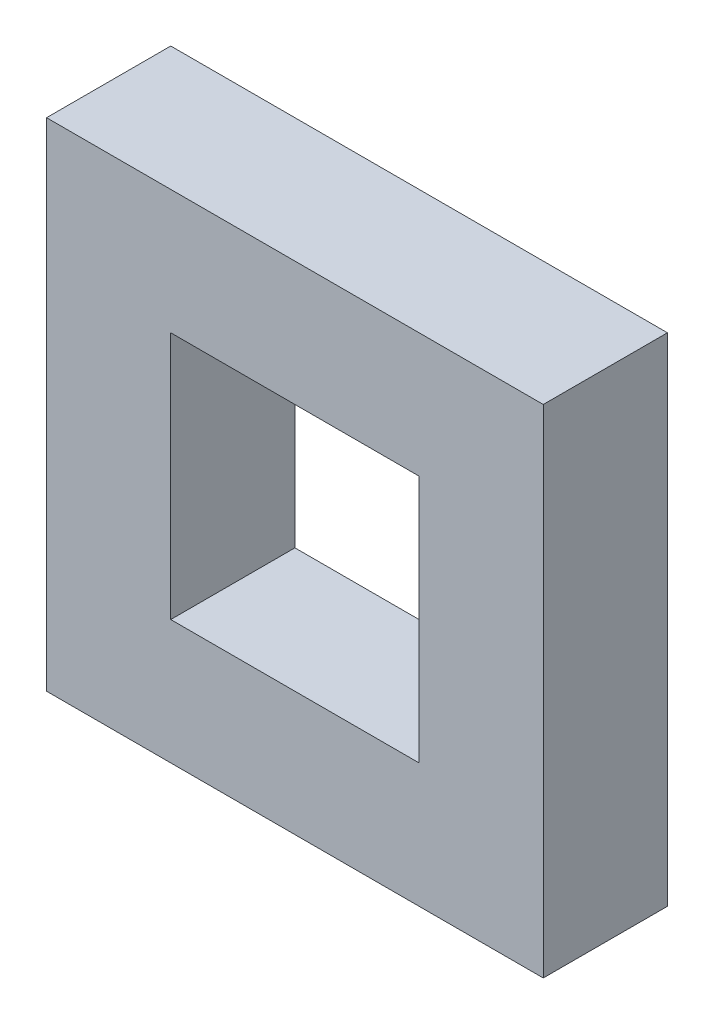
ISO-10303-21;
HEADER;
FILE_DESCRIPTION(('STEP AP214'),'2;1');
FILE_NAME('part.step','',(''),(''),'','','');
FILE_SCHEMA(('AUTOMOTIVE_DESIGN { 1 0 10303 214 1 1 1 1 }'));
ENDSEC;
DATA;
#1=APPLICATION_CONTEXT('core data for automotive mechanical design processes');
#2=APPLICATION_PROTOCOL_DEFINITION('international standard','automotive_design',2000,#1);
#3=PRODUCT_CONTEXT('',#1,'mechanical');
#4=PRODUCT('Part','Part','',(#3));
#5=PRODUCT_RELATED_PRODUCT_CATEGORY('part','',(#4));
#6=PRODUCT_DEFINITION_FORMATION('','',#4);
#7=PRODUCT_DEFINITION_CONTEXT('part definition',#1,'design');
#8=PRODUCT_DEFINITION('design','',#6,#7);
#9=PRODUCT_DEFINITION_SHAPE('','',#8);
#10=(LENGTH_UNIT() NAMED_UNIT(*) SI_UNIT(.MILLI.,.METRE.));
#11=(NAMED_UNIT(*) PLANE_ANGLE_UNIT() SI_UNIT($,.RADIAN.));
#12=(NAMED_UNIT(*) SI_UNIT($,.STERADIAN.) SOLID_ANGLE_UNIT());
#13=UNCERTAINTY_MEASURE_WITH_UNIT(LENGTH_MEASURE(1.E-05),#10,'distance_accuracy_value','');
#14=(GEOMETRIC_REPRESENTATION_CONTEXT(3) GLOBAL_UNCERTAINTY_ASSIGNED_CONTEXT((#13)) GLOBAL_UNIT_ASSIGNED_CONTEXT((#10,
#11,#12)) REPRESENTATION_CONTEXT('',''));
#15=CARTESIAN_POINT('',(0.,0.,0.));
#16=DIRECTION('',(0.,0.,1.));
#17=DIRECTION('',(1.,0.,0.));
#18=AXIS2_PLACEMENT_3D('',#15,#16,#17);
#19=CARTESIAN_POINT('',(0.,0.,5.));
#20=DIRECTION('',(1.,0.,0.));
#21=DIRECTION('',(0.,0.,-1.));
#22=AXIS2_PLACEMENT_3D('',#19,#20,#21);
#23=PLANE('',#22);
#24=DIRECTION('',(0.,-1.,0.));
#25=VECTOR('',#24,1.);
#26=CARTESIAN_POINT('',(0.,0.,0.));
#27=LINE('',#26,#25);
#28=CARTESIAN_POINT('',(0.,20.,0.));
#29=VERTEX_POINT('',#28);
#30=CARTESIAN_POINT('',(0.,0.,0.));
#31=VERTEX_POINT('',#30);
#32=EDGE_CURVE('E130',#29,#31,#27,.T.);
#33=ORIENTED_EDGE('',*,*,#32,.T.);
#34=DIRECTION('',(0.,0.,-1.));
#35=VECTOR('',#34,1.);
#36=CARTESIAN_POINT('',(0.,0.,5.));
#37=LINE('',#36,#35);
#38=CARTESIAN_POINT('',(0.,0.,5.));
#39=VERTEX_POINT('',#38);
#40=EDGE_CURVE('E11',#39,#31,#37,.T.);
#41=ORIENTED_EDGE('',*,*,#40,.F.);
#42=DIRECTION('',(0.,-1.,0.));
#43=VECTOR('',#42,1.);
#44=CARTESIAN_POINT('',(0.,0.,5.));
#45=LINE('',#44,#43);
#46=CARTESIAN_POINT('',(0.,20.,5.));
#47=VERTEX_POINT('',#46);
#48=EDGE_CURVE('E134',#47,#39,#45,.T.);
#49=ORIENTED_EDGE('',*,*,#48,.F.);
#50=DIRECTION('',(0.,0.,-1.));
#51=VECTOR('',#50,1.);
#52=CARTESIAN_POINT('',(0.,20.,5.));
#53=LINE('',#52,#51);
#54=EDGE_CURVE('E144',#47,#29,#53,.T.);
#55=ORIENTED_EDGE('',*,*,#54,.T.);
#56=EDGE_LOOP('',(#33,#41,#49,#55));
#57=FACE_BOUND('',#56,.T.);
#58=ADVANCED_FACE('F33',(#57),#23,.F.);
#59=CARTESIAN_POINT('',(0.,0.,5.));
#60=DIRECTION('',(0.,1.,0.));
#61=DIRECTION('',(0.,0.,1.));
#62=AXIS2_PLACEMENT_3D('',#59,#60,#61);
#63=PLANE('',#62);
#64=DIRECTION('',(1.,0.,0.));
#65=VECTOR('',#64,1.);
#66=CARTESIAN_POINT('',(0.,0.,0.));
#67=LINE('',#66,#65);
#68=CARTESIAN_POINT('',(20.,0.,0.));
#69=VERTEX_POINT('',#68);
#70=EDGE_CURVE('E147',#31,#69,#67,.T.);
#71=ORIENTED_EDGE('',*,*,#70,.T.);
#72=DIRECTION('',(0.,0.,-1.));
#73=VECTOR('',#72,1.);
#74=CARTESIAN_POINT('',(20.,0.,5.));
#75=LINE('',#74,#73);
#76=CARTESIAN_POINT('',(20.,0.,5.));
#77=VERTEX_POINT('',#76);
#78=EDGE_CURVE('E40',#77,#69,#75,.T.);
#79=ORIENTED_EDGE('',*,*,#78,.F.);
#80=DIRECTION('',(1.,0.,0.));
#81=VECTOR('',#80,1.);
#82=CARTESIAN_POINT('',(0.,0.,5.));
#83=LINE('',#82,#81);
#84=EDGE_CURVE('E137',#39,#77,#83,.T.);
#85=ORIENTED_EDGE('',*,*,#84,.F.);
#86=ORIENTED_EDGE('',*,*,#40,.T.);
#87=EDGE_LOOP('',(#71,#79,#85,#86));
#88=FACE_BOUND('',#87,.T.);
#89=ADVANCED_FACE('F175',(#88),#63,.F.);
#90=CARTESIAN_POINT('',(20.,0.,5.));
#91=DIRECTION('',(-1.,0.,0.));
#92=DIRECTION('',(0.,0.,1.));
#93=AXIS2_PLACEMENT_3D('',#90,#91,#92);
#94=PLANE('',#93);
#95=DIRECTION('',(0.,1.,0.));
#96=VECTOR('',#95,1.);
#97=CARTESIAN_POINT('',(20.,0.,0.));
#98=LINE('',#97,#96);
#99=CARTESIAN_POINT('',(20.,20.,0.));
#100=VERTEX_POINT('',#99);
#101=EDGE_CURVE('E149',#69,#100,#98,.T.);
#102=ORIENTED_EDGE('',*,*,#101,.T.);
#103=DIRECTION('',(0.,0.,-1.));
#104=VECTOR('',#103,1.);
#105=CARTESIAN_POINT('',(20.,20.,5.));
#106=LINE('',#105,#104);
#107=CARTESIAN_POINT('',(20.,20.,5.));
#108=VERTEX_POINT('',#107);
#109=EDGE_CURVE('E154',#108,#100,#106,.T.);
#110=ORIENTED_EDGE('',*,*,#109,.F.);
#111=DIRECTION('',(0.,1.,0.));
#112=VECTOR('',#111,1.);
#113=CARTESIAN_POINT('',(20.,0.,5.));
#114=LINE('',#113,#112);
#115=EDGE_CURVE('E140',#77,#108,#114,.T.);
#116=ORIENTED_EDGE('',*,*,#115,.F.);
#117=ORIENTED_EDGE('',*,*,#78,.T.);
#118=EDGE_LOOP('',(#102,#110,#116,#117));
#119=FACE_BOUND('',#118,.T.);
#120=ADVANCED_FACE('F161',(#119),#94,.F.);
#121=CARTESIAN_POINT('',(0.,20.,5.));
#122=DIRECTION('',(0.,-1.,0.));
#123=DIRECTION('',(1.,0.,0.));
#124=AXIS2_PLACEMENT_3D('',#121,#122,#123);
#125=PLANE('',#124);
#126=DIRECTION('',(-1.,0.,0.));
#127=VECTOR('',#126,1.);
#128=CARTESIAN_POINT('',(0.,20.,0.));
#129=LINE('',#128,#127);
#130=EDGE_CURVE('E138',#100,#29,#129,.T.);
#131=ORIENTED_EDGE('',*,*,#130,.T.);
#132=ORIENTED_EDGE('',*,*,#54,.F.);
#133=DIRECTION('',(-1.,0.,0.));
#134=VECTOR('',#133,1.);
#135=CARTESIAN_POINT('',(0.,20.,5.));
#136=LINE('',#135,#134);
#137=EDGE_CURVE('E142',#108,#47,#136,.T.);
#138=ORIENTED_EDGE('',*,*,#137,.F.);
#139=ORIENTED_EDGE('',*,*,#109,.T.);
#140=EDGE_LOOP('',(#131,#132,#138,#139));
#141=FACE_BOUND('',#140,.T.);
#142=ADVANCED_FACE('F168',(#141),#125,.F.);
#143=CARTESIAN_POINT('',(0.,0.,5.));
#144=DIRECTION('',(0.,0.,-1.));
#145=DIRECTION('',(-1.,0.,0.));
#146=AXIS2_PLACEMENT_3D('',#143,#144,#145);
#147=PLANE('',#146);
#148=DIRECTION('',(1.,0.,0.));
#149=VECTOR('',#148,1.);
#150=CARTESIAN_POINT('',(5.,5.,5.));
#151=LINE('',#150,#149);
#152=CARTESIAN_POINT('',(5.,5.,5.));
#153=VERTEX_POINT('',#152);
#154=CARTESIAN_POINT('',(15.,5.,5.));
#155=VERTEX_POINT('',#154);
#156=EDGE_CURVE('E124',#153,#155,#151,.T.);
#157=ORIENTED_EDGE('',*,*,#156,.F.);
#158=DIRECTION('',(0.,-1.,0.));
#159=VECTOR('',#158,1.);
#160=CARTESIAN_POINT('',(5.,5.,5.));
#161=LINE('',#160,#159);
#162=CARTESIAN_POINT('',(5.,15.,5.));
#163=VERTEX_POINT('',#162);
#164=EDGE_CURVE('E47',#163,#153,#161,.T.);
#165=ORIENTED_EDGE('',*,*,#164,.F.);
#166=DIRECTION('',(-1.,0.,0.));
#167=VECTOR('',#166,1.);
#168=CARTESIAN_POINT('',(5.,15.,5.));
#169=LINE('',#168,#167);
#170=CARTESIAN_POINT('',(15.,15.,5.));
#171=VERTEX_POINT('',#170);
#172=EDGE_CURVE('E115',#171,#163,#169,.T.);
#173=ORIENTED_EDGE('',*,*,#172,.F.);
#174=DIRECTION('',(0.,1.,0.));
#175=VECTOR('',#174,1.);
#176=CARTESIAN_POINT('',(15.,5.,5.));
#177=LINE('',#176,#175);
#178=EDGE_CURVE('E118',#155,#171,#177,.T.);
#179=ORIENTED_EDGE('',*,*,#178,.F.);
#180=EDGE_LOOP('',(#157,#165,#173,#179));
#181=FACE_BOUND('',#180,.T.);
#182=ORIENTED_EDGE('',*,*,#48,.T.);
#183=ORIENTED_EDGE('',*,*,#84,.T.);
#184=ORIENTED_EDGE('',*,*,#115,.T.);
#185=ORIENTED_EDGE('',*,*,#137,.T.);
#186=EDGE_LOOP('',(#182,#183,#184,#185));
#187=FACE_BOUND('',#186,.T.);
#188=ADVANCED_FACE('F174',(#181,#187),#147,.F.);
#189=CARTESIAN_POINT('',(0.,0.,0.));
#190=DIRECTION('',(0.,0.,-1.));
#191=DIRECTION('',(-1.,0.,0.));
#192=AXIS2_PLACEMENT_3D('',#189,#190,#191);
#193=PLANE('',#192);
#194=DIRECTION('',(0.,-1.,0.));
#195=VECTOR('',#194,1.);
#196=CARTESIAN_POINT('',(5.,5.,0.));
#197=LINE('',#196,#195);
#198=CARTESIAN_POINT('',(5.,15.,0.));
#199=VERTEX_POINT('',#198);
#200=CARTESIAN_POINT('',(5.,5.,0.));
#201=VERTEX_POINT('',#200);
#202=EDGE_CURVE('E99',#199,#201,#197,.T.);
#203=ORIENTED_EDGE('',*,*,#202,.T.);
#204=DIRECTION('',(1.,0.,0.));
#205=VECTOR('',#204,1.);
#206=CARTESIAN_POINT('',(5.,5.,0.));
#207=LINE('',#206,#205);
#208=CARTESIAN_POINT('',(15.,5.,0.));
#209=VERTEX_POINT('',#208);
#210=EDGE_CURVE('E108',#201,#209,#207,.T.);
#211=ORIENTED_EDGE('',*,*,#210,.T.);
#212=DIRECTION('',(0.,1.,0.));
#213=VECTOR('',#212,1.);
#214=CARTESIAN_POINT('',(15.,5.,0.));
#215=LINE('',#214,#213);
#216=CARTESIAN_POINT('',(15.,15.,0.));
#217=VERTEX_POINT('',#216);
#218=EDGE_CURVE('E55',#209,#217,#215,.T.);
#219=ORIENTED_EDGE('',*,*,#218,.T.);
#220=DIRECTION('',(-1.,0.,0.));
#221=VECTOR('',#220,1.);
#222=CARTESIAN_POINT('',(5.,15.,0.));
#223=LINE('',#222,#221);
#224=EDGE_CURVE('E105',#217,#199,#223,.T.);
#225=ORIENTED_EDGE('',*,*,#224,.T.);
#226=EDGE_LOOP('',(#203,#211,#219,#225));
#227=FACE_BOUND('',#226,.T.);
#228=ORIENTED_EDGE('',*,*,#32,.F.);
#229=ORIENTED_EDGE('',*,*,#130,.F.);
#230=ORIENTED_EDGE('',*,*,#101,.F.);
#231=ORIENTED_EDGE('',*,*,#70,.F.);
#232=EDGE_LOOP('',(#228,#229,#230,#231));
#233=FACE_BOUND('',#232,.T.);
#234=ADVANCED_FACE('F112',(#227,#233),#193,.T.);
#235=CARTESIAN_POINT('',(5.,5.,0.));
#236=DIRECTION('',(-1.,0.,0.));
#237=DIRECTION('',(0.,0.,1.));
#238=AXIS2_PLACEMENT_3D('',#235,#236,#237);
#239=PLANE('',#238);
#240=ORIENTED_EDGE('',*,*,#164,.T.);
#241=DIRECTION('',(0.,0.,1.));
#242=VECTOR('',#241,1.);
#243=CARTESIAN_POINT('',(5.,5.,0.));
#244=LINE('',#243,#242);
#245=EDGE_CURVE('E95',#201,#153,#244,.T.);
#246=ORIENTED_EDGE('',*,*,#245,.F.);
#247=ORIENTED_EDGE('',*,*,#202,.F.);
#248=DIRECTION('',(0.,0.,1.));
#249=VECTOR('',#248,1.);
#250=CARTESIAN_POINT('',(5.,15.,0.));
#251=LINE('',#250,#249);
#252=EDGE_CURVE('E128',#199,#163,#251,.T.);
#253=ORIENTED_EDGE('',*,*,#252,.T.);
#254=EDGE_LOOP('',(#240,#246,#247,#253));
#255=FACE_BOUND('',#254,.T.);
#256=ADVANCED_FACE('F97',(#255),#239,.F.);
#257=CARTESIAN_POINT('',(5.,15.,0.));
#258=DIRECTION('',(0.,1.,0.));
#259=DIRECTION('',(0.,0.,1.));
#260=AXIS2_PLACEMENT_3D('',#257,#258,#259);
#261=PLANE('',#260);
#262=ORIENTED_EDGE('',*,*,#172,.T.);
#263=ORIENTED_EDGE('',*,*,#252,.F.);
#264=ORIENTED_EDGE('',*,*,#224,.F.);
#265=DIRECTION('',(0.,0.,1.));
#266=VECTOR('',#265,1.);
#267=CARTESIAN_POINT('',(15.,15.,0.));
#268=LINE('',#267,#266);
#269=EDGE_CURVE('E131',#217,#171,#268,.T.);
#270=ORIENTED_EDGE('',*,*,#269,.T.);
#271=EDGE_LOOP('',(#262,#263,#264,#270));
#272=FACE_BOUND('',#271,.T.);
#273=ADVANCED_FACE('F192',(#272),#261,.F.);
#274=CARTESIAN_POINT('',(15.,5.,0.));
#275=DIRECTION('',(1.,0.,0.));
#276=DIRECTION('',(0.,0.,-1.));
#277=AXIS2_PLACEMENT_3D('',#274,#275,#276);
#278=PLANE('',#277);
#279=ORIENTED_EDGE('',*,*,#178,.T.);
#280=ORIENTED_EDGE('',*,*,#269,.F.);
#281=ORIENTED_EDGE('',*,*,#218,.F.);
#282=DIRECTION('',(0.,0.,1.));
#283=VECTOR('',#282,1.);
#284=CARTESIAN_POINT('',(15.,5.,0.));
#285=LINE('',#284,#283);
#286=EDGE_CURVE('E104',#209,#155,#285,.T.);
#287=ORIENTED_EDGE('',*,*,#286,.T.);
#288=EDGE_LOOP('',(#279,#280,#281,#287));
#289=FACE_BOUND('',#288,.T.);
#290=ADVANCED_FACE('F195',(#289),#278,.F.);
#291=CARTESIAN_POINT('',(5.,5.,0.));
#292=DIRECTION('',(0.,-1.,0.));
#293=DIRECTION('',(0.,0.,-1.));
#294=AXIS2_PLACEMENT_3D('',#291,#292,#293);
#295=PLANE('',#294);
#296=ORIENTED_EDGE('',*,*,#156,.T.);
#297=ORIENTED_EDGE('',*,*,#286,.F.);
#298=ORIENTED_EDGE('',*,*,#210,.F.);
#299=ORIENTED_EDGE('',*,*,#245,.T.);
#300=EDGE_LOOP('',(#296,#297,#298,#299));
#301=FACE_BOUND('',#300,.T.);
#302=ADVANCED_FACE('F109',(#301),#295,.F.);
#303=CLOSED_SHELL('',(#58,#89,#120,#142,#188,#234,#256,#273,#290,#302));
#304=MANIFOLD_SOLID_BREP('B2',#303);
#305=ADVANCED_BREP_SHAPE_REPRESENTATION('',(#18,#304),#14);
#306=SHAPE_DEFINITION_REPRESENTATION(#9,#305);
ENDSEC;
END-ISO-10303-21;
